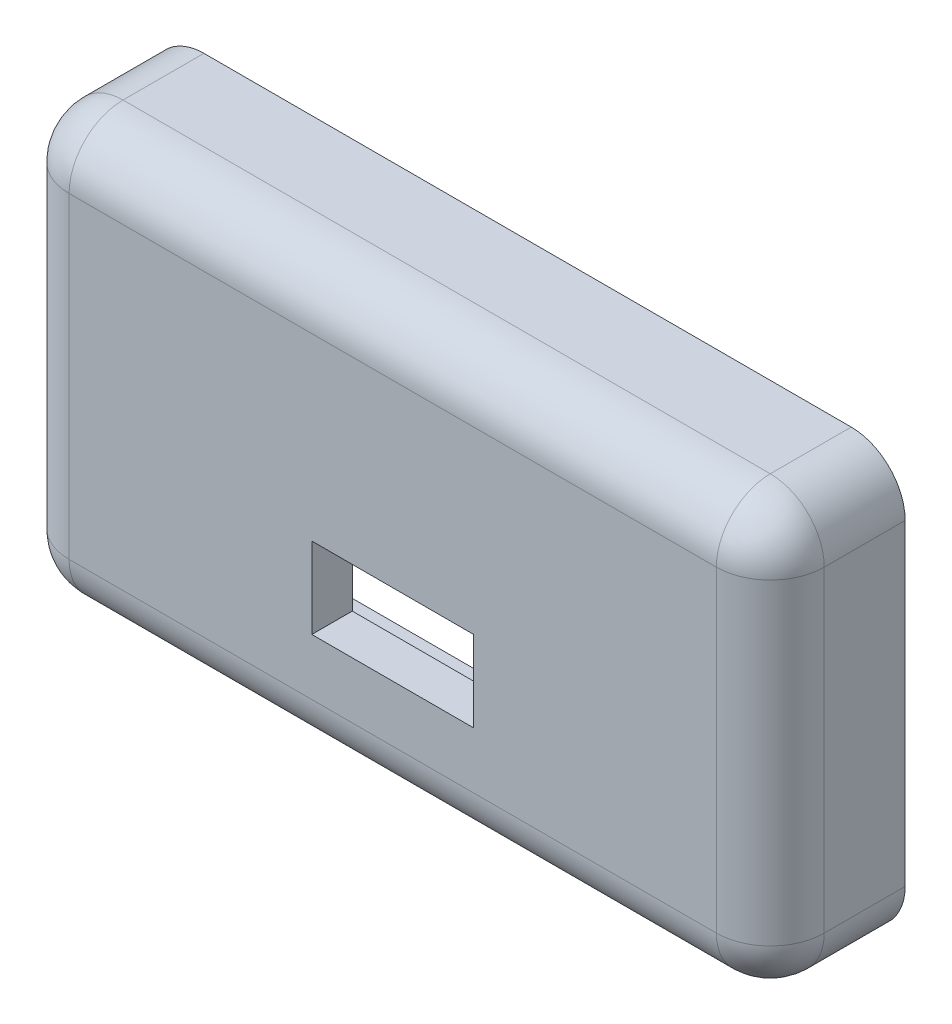
ISO-10303-21;
HEADER;
FILE_DESCRIPTION(('STEP AP214'),'2;1');
FILE_NAME('part.step','',(''),(''),'','','');
FILE_SCHEMA(('AUTOMOTIVE_DESIGN { 1 0 10303 214 1 1 1 1 }'));
ENDSEC;
DATA;
#1=APPLICATION_CONTEXT('core data for automotive mechanical design processes');
#2=APPLICATION_PROTOCOL_DEFINITION('international standard','automotive_design',2000,#1);
#3=PRODUCT_CONTEXT('',#1,'mechanical');
#4=PRODUCT('Part','Part','',(#3));
#5=PRODUCT_RELATED_PRODUCT_CATEGORY('part','',(#4));
#6=PRODUCT_DEFINITION_FORMATION('','',#4);
#7=PRODUCT_DEFINITION_CONTEXT('part definition',#1,'design');
#8=PRODUCT_DEFINITION('design','',#6,#7);
#9=PRODUCT_DEFINITION_SHAPE('','',#8);
#10=(LENGTH_UNIT() NAMED_UNIT(*) SI_UNIT(.MILLI.,.METRE.));
#11=(NAMED_UNIT(*) PLANE_ANGLE_UNIT() SI_UNIT($,.RADIAN.));
#12=(NAMED_UNIT(*) SI_UNIT($,.STERADIAN.) SOLID_ANGLE_UNIT());
#13=UNCERTAINTY_MEASURE_WITH_UNIT(LENGTH_MEASURE(1.E-05),#10,'distance_accuracy_value','');
#14=(GEOMETRIC_REPRESENTATION_CONTEXT(3) GLOBAL_UNCERTAINTY_ASSIGNED_CONTEXT((#13)) GLOBAL_UNIT_ASSIGNED_CONTEXT((#10,
#11,#12)) REPRESENTATION_CONTEXT('',''));
#15=CARTESIAN_POINT('',(0.,0.,0.));
#16=DIRECTION('',(0.,0.,1.));
#17=DIRECTION('',(1.,0.,0.));
#18=AXIS2_PLACEMENT_3D('',#15,#16,#17);
#19=CARTESIAN_POINT('',(0.,0.,0.));
#20=DIRECTION('',(0.,0.,1.));
#21=DIRECTION('',(1.,0.,0.));
#22=AXIS2_PLACEMENT_3D('',#19,#20,#21);
#23=PLANE('',#22);
#24=DIRECTION('',(-1.,0.,0.));
#25=VECTOR('',#24,1.);
#26=CARTESIAN_POINT('',(13.,-6.875,0.));
#27=LINE('',#26,#25);
#28=CARTESIAN_POINT('',(13.,-6.875,0.));
#29=VERTEX_POINT('',#28);
#30=CARTESIAN_POINT('',(-13.,-6.875,0.));
#31=VERTEX_POINT('',#30);
#32=EDGE_CURVE('E173',#29,#31,#27,.T.);
#33=ORIENTED_EDGE('',*,*,#32,.T.);
#34=DIRECTION('',(0.,1.,0.));
#35=VECTOR('',#34,1.);
#36=CARTESIAN_POINT('',(-13.,-6.875,0.));
#37=LINE('',#36,#35);
#38=CARTESIAN_POINT('',(-13.,6.875,0.));
#39=VERTEX_POINT('',#38);
#40=EDGE_CURVE('E192',#31,#39,#37,.T.);
#41=ORIENTED_EDGE('',*,*,#40,.T.);
#42=DIRECTION('',(1.,0.,0.));
#43=VECTOR('',#42,1.);
#44=CARTESIAN_POINT('',(13.,6.875,0.));
#45=LINE('',#44,#43);
#46=CARTESIAN_POINT('',(13.,6.875,0.));
#47=VERTEX_POINT('',#46);
#48=EDGE_CURVE('E179',#39,#47,#45,.T.);
#49=ORIENTED_EDGE('',*,*,#48,.T.);
#50=DIRECTION('',(0.,-1.,0.));
#51=VECTOR('',#50,1.);
#52=CARTESIAN_POINT('',(13.,-6.875,0.));
#53=LINE('',#52,#51);
#54=EDGE_CURVE('E195',#47,#29,#53,.T.);
#55=ORIENTED_EDGE('',*,*,#54,.T.);
#56=EDGE_LOOP('',(#33,#41,#49,#55));
#57=FACE_BOUND('',#56,.T.);
#58=CARTESIAN_POINT('',(-10.,0.,0.));
#59=DIRECTION('',(0.,0.,1.));
#60=DIRECTION('',(1.,0.,0.));
#61=AXIS2_PLACEMENT_3D('',#58,#59,#60);
#62=CIRCLE('',#61,2.475);
#63=CARTESIAN_POINT('',(-7.525,0.,0.));
#64=VERTEX_POINT('',#63);
#65=EDGE_CURVE('E267',#64,#64,#62,.F.);
#66=ORIENTED_EDGE('',*,*,#65,.F.);
#67=EDGE_LOOP('',(#66));
#68=FACE_BOUND('',#67,.T.);
#69=DIRECTION('',(0.,1.,0.));
#70=VECTOR('',#69,1.);
#71=CARTESIAN_POINT('',(3.,-0.785,0.));
#72=LINE('',#71,#70);
#73=CARTESIAN_POINT('',(3.,-3.785,0.));
#74=VERTEX_POINT('',#73);
#75=CARTESIAN_POINT('',(3.,-0.785,0.));
#76=VERTEX_POINT('',#75);
#77=EDGE_CURVE('E243',#74,#76,#72,.T.);
#78=ORIENTED_EDGE('',*,*,#77,.T.);
#79=DIRECTION('',(-1.,0.,0.));
#80=VECTOR('',#79,1.);
#81=CARTESIAN_POINT('',(-3.,-0.785,0.));
#82=LINE('',#81,#80);
#83=CARTESIAN_POINT('',(-3.,-0.785,0.));
#84=VERTEX_POINT('',#83);
#85=EDGE_CURVE('E248',#76,#84,#82,.T.);
#86=ORIENTED_EDGE('',*,*,#85,.T.);
#87=DIRECTION('',(0.,-1.,0.));
#88=VECTOR('',#87,1.);
#89=CARTESIAN_POINT('',(-3.,-0.785,0.));
#90=LINE('',#89,#88);
#91=CARTESIAN_POINT('',(-3.,-3.785,0.));
#92=VERTEX_POINT('',#91);
#93=EDGE_CURVE('E251',#84,#92,#90,.T.);
#94=ORIENTED_EDGE('',*,*,#93,.T.);
#95=DIRECTION('',(1.,0.,0.));
#96=VECTOR('',#95,1.);
#97=CARTESIAN_POINT('',(-3.,-3.785,0.));
#98=LINE('',#97,#96);
#99=EDGE_CURVE('E254',#92,#74,#98,.T.);
#100=ORIENTED_EDGE('',*,*,#99,.T.);
#101=EDGE_LOOP('',(#78,#86,#94,#100));
#102=FACE_BOUND('',#101,.T.);
#103=CARTESIAN_POINT('',(10.,0.,0.));
#104=DIRECTION('',(0.,0.,1.));
#105=DIRECTION('',(1.,0.,0.));
#106=AXIS2_PLACEMENT_3D('',#103,#104,#105);
#107=CIRCLE('',#106,2.475);
#108=CARTESIAN_POINT('',(12.475,0.,0.));
#109=VERTEX_POINT('',#108);
#110=EDGE_CURVE('E270',#109,#109,#107,.F.);
#111=ORIENTED_EDGE('',*,*,#110,.F.);
#112=EDGE_LOOP('',(#111));
#113=FACE_BOUND('',#112,.T.);
#114=ADVANCED_FACE('F38',(#57,#68,#102,#113),#23,.F.);
#115=CARTESIAN_POINT('',(14.,7.875,1.));
#116=DIRECTION('',(-1.,0.,0.));
#117=DIRECTION('',(0.,0.,1.));
#118=AXIS2_PLACEMENT_3D('',#115,#116,#117);
#119=PLANE('',#118);
#120=DIRECTION('',(0.,1.,0.));
#121=VECTOR('',#120,1.);
#122=CARTESIAN_POINT('',(14.,-7.875,-0.5));
#123=LINE('',#122,#121);
#124=CARTESIAN_POINT('',(14.,5.875,-0.5));
#125=VERTEX_POINT('',#124);
#126=CARTESIAN_POINT('',(14.,-5.875,-0.5));
#127=VERTEX_POINT('',#126);
#128=EDGE_CURVE('E275',#125,#127,#123,.F.);
#129=ORIENTED_EDGE('',*,*,#128,.T.);
#130=DIRECTION('',(0.,0.,-1.));
#131=VECTOR('',#130,1.);
#132=CARTESIAN_POINT('',(14.,-5.875,1.));
#133=LINE('',#132,#131);
#134=CARTESIAN_POINT('',(14.,-5.875,-3.5));
#135=VERTEX_POINT('',#134);
#136=EDGE_CURVE('E277',#127,#135,#133,.T.);
#137=ORIENTED_EDGE('',*,*,#136,.T.);
#138=DIRECTION('',(0.,-1.,0.));
#139=VECTOR('',#138,1.);
#140=CARTESIAN_POINT('',(14.,7.875,-3.5));
#141=LINE('',#140,#139);
#142=CARTESIAN_POINT('',(14.,5.875,-3.5));
#143=VERTEX_POINT('',#142);
#144=EDGE_CURVE('E206',#143,#135,#141,.T.);
#145=ORIENTED_EDGE('',*,*,#144,.F.);
#146=DIRECTION('',(0.,0.,-1.));
#147=VECTOR('',#146,1.);
#148=CARTESIAN_POINT('',(14.,5.875,1.));
#149=LINE('',#148,#147);
#150=EDGE_CURVE('E273',#143,#125,#149,.F.);
#151=ORIENTED_EDGE('',*,*,#150,.T.);
#152=EDGE_LOOP('',(#129,#137,#145,#151));
#153=FACE_BOUND('',#152,.T.);
#154=ADVANCED_FACE('F388',(#153),#119,.F.);
#155=CARTESIAN_POINT('',(-14.,7.875,1.));
#156=DIRECTION('',(0.,-1.,0.));
#157=DIRECTION('',(0.,0.,-1.));
#158=AXIS2_PLACEMENT_3D('',#155,#156,#157);
#159=PLANE('',#158);
#160=DIRECTION('',(-1.,0.,0.));
#161=VECTOR('',#160,1.);
#162=CARTESIAN_POINT('',(14.,7.875,-0.5));
#163=LINE('',#162,#161);
#164=CARTESIAN_POINT('',(-12.,7.875,-0.5));
#165=VERTEX_POINT('',#164);
#166=CARTESIAN_POINT('',(12.,7.875,-0.5));
#167=VERTEX_POINT('',#166);
#168=EDGE_CURVE('E305',#165,#167,#163,.F.);
#169=ORIENTED_EDGE('',*,*,#168,.T.);
#170=DIRECTION('',(0.,0.,-1.));
#171=VECTOR('',#170,1.);
#172=CARTESIAN_POINT('',(12.,7.875,1.));
#173=LINE('',#172,#171);
#174=CARTESIAN_POINT('',(12.,7.875,-3.5));
#175=VERTEX_POINT('',#174);
#176=EDGE_CURVE('E307',#167,#175,#173,.T.);
#177=ORIENTED_EDGE('',*,*,#176,.T.);
#178=DIRECTION('',(1.,0.,0.));
#179=VECTOR('',#178,1.);
#180=CARTESIAN_POINT('',(-14.,7.875,-3.5));
#181=LINE('',#180,#179);
#182=CARTESIAN_POINT('',(-12.,7.875,-3.5));
#183=VERTEX_POINT('',#182);
#184=EDGE_CURVE('E180',#183,#175,#181,.T.);
#185=ORIENTED_EDGE('',*,*,#184,.F.);
#186=DIRECTION('',(0.,0.,-1.));
#187=VECTOR('',#186,1.);
#188=CARTESIAN_POINT('',(-12.,7.875,1.));
#189=LINE('',#188,#187);
#190=EDGE_CURVE('E303',#183,#165,#189,.F.);
#191=ORIENTED_EDGE('',*,*,#190,.T.);
#192=EDGE_LOOP('',(#169,#177,#185,#191));
#193=FACE_BOUND('',#192,.T.);
#194=ADVANCED_FACE('F379',(#193),#159,.F.);
#195=CARTESIAN_POINT('',(-14.,7.875,1.));
#196=DIRECTION('',(1.,0.,0.));
#197=DIRECTION('',(0.,1.,0.));
#198=AXIS2_PLACEMENT_3D('',#195,#196,#197);
#199=PLANE('',#198);
#200=DIRECTION('',(0.,1.,0.));
#201=VECTOR('',#200,1.);
#202=CARTESIAN_POINT('',(-14.,-7.875,-3.5));
#203=LINE('',#202,#201);
#204=CARTESIAN_POINT('',(-14.,-5.875,-3.5));
#205=VERTEX_POINT('',#204);
#206=CARTESIAN_POINT('',(-14.,5.875,-3.5));
#207=VERTEX_POINT('',#206);
#208=EDGE_CURVE('E212',#205,#207,#203,.T.);
#209=ORIENTED_EDGE('',*,*,#208,.F.);
#210=DIRECTION('',(0.,0.,-1.));
#211=VECTOR('',#210,1.);
#212=CARTESIAN_POINT('',(-14.,-5.875,1.));
#213=LINE('',#212,#211);
#214=CARTESIAN_POINT('',(-14.,-5.875,-0.5));
#215=VERTEX_POINT('',#214);
#216=EDGE_CURVE('E11',#205,#215,#213,.F.);
#217=ORIENTED_EDGE('',*,*,#216,.T.);
#218=DIRECTION('',(0.,-1.,0.));
#219=VECTOR('',#218,1.);
#220=CARTESIAN_POINT('',(-14.,7.875,-0.5));
#221=LINE('',#220,#219);
#222=CARTESIAN_POINT('',(-14.,5.875,-0.5));
#223=VERTEX_POINT('',#222);
#224=EDGE_CURVE('E47',#215,#223,#221,.F.);
#225=ORIENTED_EDGE('',*,*,#224,.T.);
#226=DIRECTION('',(0.,0.,-1.));
#227=VECTOR('',#226,1.);
#228=CARTESIAN_POINT('',(-14.,5.875,1.));
#229=LINE('',#228,#227);
#230=EDGE_CURVE('E309',#223,#207,#229,.T.);
#231=ORIENTED_EDGE('',*,*,#230,.T.);
#232=EDGE_LOOP('',(#209,#217,#225,#231));
#233=FACE_BOUND('',#232,.T.);
#234=ADVANCED_FACE('F354',(#233),#199,.F.);
#235=CARTESIAN_POINT('',(-14.,-7.875,1.));
#236=DIRECTION('',(0.,1.,0.));
#237=DIRECTION('',(0.,0.,1.));
#238=AXIS2_PLACEMENT_3D('',#235,#236,#237);
#239=PLANE('',#238);
#240=DIRECTION('',(-1.,0.,0.));
#241=VECTOR('',#240,1.);
#242=CARTESIAN_POINT('',(14.,-7.875,-3.5));
#243=LINE('',#242,#241);
#244=CARTESIAN_POINT('',(12.,-7.875,-3.5));
#245=VERTEX_POINT('',#244);
#246=CARTESIAN_POINT('',(-12.,-7.875,-3.5));
#247=VERTEX_POINT('',#246);
#248=EDGE_CURVE('E209',#245,#247,#243,.T.);
#249=ORIENTED_EDGE('',*,*,#248,.F.);
#250=DIRECTION('',(0.,0.,-1.));
#251=VECTOR('',#250,1.);
#252=CARTESIAN_POINT('',(12.,-7.875,1.));
#253=LINE('',#252,#251);
#254=CARTESIAN_POINT('',(12.,-7.875,-0.5));
#255=VERTEX_POINT('',#254);
#256=EDGE_CURVE('E292',#245,#255,#253,.F.);
#257=ORIENTED_EDGE('',*,*,#256,.T.);
#258=DIRECTION('',(1.,0.,0.));
#259=VECTOR('',#258,1.);
#260=CARTESIAN_POINT('',(-14.,-7.875,-0.5));
#261=LINE('',#260,#259);
#262=CARTESIAN_POINT('',(-12.,-7.875,-0.5));
#263=VERTEX_POINT('',#262);
#264=EDGE_CURVE('E290',#255,#263,#261,.F.);
#265=ORIENTED_EDGE('',*,*,#264,.T.);
#266=DIRECTION('',(0.,0.,-1.));
#267=VECTOR('',#266,1.);
#268=CARTESIAN_POINT('',(-12.,-7.875,1.));
#269=LINE('',#268,#267);
#270=EDGE_CURVE('E288',#263,#247,#269,.T.);
#271=ORIENTED_EDGE('',*,*,#270,.T.);
#272=EDGE_LOOP('',(#249,#257,#265,#271));
#273=FACE_BOUND('',#272,.T.);
#274=ADVANCED_FACE('F397',(#273),#239,.F.);
#275=CARTESIAN_POINT('',(3.,-0.785,1.));
#276=DIRECTION('',(-1.,0.,0.));
#277=DIRECTION('',(0.,-1.,0.));
#278=AXIS2_PLACEMENT_3D('',#275,#276,#277);
#279=PLANE('',#278);
#280=ORIENTED_EDGE('',*,*,#77,.F.);
#281=DIRECTION('',(0.,0.,-1.));
#282=VECTOR('',#281,1.);
#283=CARTESIAN_POINT('',(3.,-3.785,1.));
#284=LINE('',#283,#282);
#285=CARTESIAN_POINT('',(3.,-3.785,1.5));
#286=VERTEX_POINT('',#285);
#287=EDGE_CURVE('E257',#286,#74,#284,.T.);
#288=ORIENTED_EDGE('',*,*,#287,.F.);
#289=DIRECTION('',(0.,1.,0.));
#290=VECTOR('',#289,1.);
#291=CARTESIAN_POINT('',(3.,-3.785,1.5));
#292=LINE('',#291,#290);
#293=CARTESIAN_POINT('',(3.,-0.785,1.5));
#294=VERTEX_POINT('',#293);
#295=EDGE_CURVE('E230',#286,#294,#292,.T.);
#296=ORIENTED_EDGE('',*,*,#295,.T.);
#297=DIRECTION('',(0.,0.,-1.));
#298=VECTOR('',#297,1.);
#299=CARTESIAN_POINT('',(3.,-0.785,1.));
#300=LINE('',#299,#298);
#301=EDGE_CURVE('E264',#294,#76,#300,.T.);
#302=ORIENTED_EDGE('',*,*,#301,.T.);
#303=EDGE_LOOP('',(#280,#288,#296,#302));
#304=FACE_BOUND('',#303,.T.);
#305=ADVANCED_FACE('F426',(#304),#279,.T.);
#306=CARTESIAN_POINT('',(-3.,-0.785,1.));
#307=DIRECTION('',(0.,-1.,0.));
#308=DIRECTION('',(0.,0.,-1.));
#309=AXIS2_PLACEMENT_3D('',#306,#307,#308);
#310=PLANE('',#309);
#311=ORIENTED_EDGE('',*,*,#85,.F.);
#312=ORIENTED_EDGE('',*,*,#301,.F.);
#313=DIRECTION('',(-1.,0.,0.));
#314=VECTOR('',#313,1.);
#315=CARTESIAN_POINT('',(3.,-0.785,1.5));
#316=LINE('',#315,#314);
#317=CARTESIAN_POINT('',(-3.,-0.785,1.5));
#318=VERTEX_POINT('',#317);
#319=EDGE_CURVE('E233',#294,#318,#316,.T.);
#320=ORIENTED_EDGE('',*,*,#319,.T.);
#321=DIRECTION('',(0.,0.,-1.));
#322=VECTOR('',#321,1.);
#323=CARTESIAN_POINT('',(-3.,-0.785,1.));
#324=LINE('',#323,#322);
#325=EDGE_CURVE('E262',#318,#84,#324,.T.);
#326=ORIENTED_EDGE('',*,*,#325,.T.);
#327=EDGE_LOOP('',(#311,#312,#320,#326));
#328=FACE_BOUND('',#327,.T.);
#329=ADVANCED_FACE('F696',(#328),#310,.T.);
#330=CARTESIAN_POINT('',(-3.,-0.785,1.));
#331=DIRECTION('',(1.,0.,0.));
#332=DIRECTION('',(0.,1.,0.));
#333=AXIS2_PLACEMENT_3D('',#330,#331,#332);
#334=PLANE('',#333);
#335=ORIENTED_EDGE('',*,*,#93,.F.);
#336=ORIENTED_EDGE('',*,*,#325,.F.);
#337=DIRECTION('',(0.,-1.,0.));
#338=VECTOR('',#337,1.);
#339=CARTESIAN_POINT('',(-3.,-0.785,1.5));
#340=LINE('',#339,#338);
#341=CARTESIAN_POINT('',(-3.,-3.785,1.5));
#342=VERTEX_POINT('',#341);
#343=EDGE_CURVE('E236',#318,#342,#340,.T.);
#344=ORIENTED_EDGE('',*,*,#343,.T.);
#345=DIRECTION('',(0.,0.,-1.));
#346=VECTOR('',#345,1.);
#347=CARTESIAN_POINT('',(-3.,-3.785,1.));
#348=LINE('',#347,#346);
#349=EDGE_CURVE('E260',#342,#92,#348,.T.);
#350=ORIENTED_EDGE('',*,*,#349,.T.);
#351=EDGE_LOOP('',(#335,#336,#344,#350));
#352=FACE_BOUND('',#351,.T.);
#353=ADVANCED_FACE('F684',(#352),#334,.T.);
#354=CARTESIAN_POINT('',(-3.,-3.785,1.));
#355=DIRECTION('',(0.,1.,0.));
#356=DIRECTION('',(0.,0.,1.));
#357=AXIS2_PLACEMENT_3D('',#354,#355,#356);
#358=PLANE('',#357);
#359=ORIENTED_EDGE('',*,*,#99,.F.);
#360=ORIENTED_EDGE('',*,*,#349,.F.);
#361=DIRECTION('',(1.,0.,0.));
#362=VECTOR('',#361,1.);
#363=CARTESIAN_POINT('',(-3.,-3.785,1.5));
#364=LINE('',#363,#362);
#365=EDGE_CURVE('E227',#342,#286,#364,.T.);
#366=ORIENTED_EDGE('',*,*,#365,.T.);
#367=ORIENTED_EDGE('',*,*,#287,.T.);
#368=EDGE_LOOP('',(#359,#360,#366,#367));
#369=FACE_BOUND('',#368,.T.);
#370=ADVANCED_FACE('F662',(#369),#358,.T.);
#371=CARTESIAN_POINT('',(0.,0.,1.5));
#372=DIRECTION('',(0.,0.,1.));
#373=DIRECTION('',(1.,0.,0.));
#374=AXIS2_PLACEMENT_3D('',#371,#372,#373);
#375=PLANE('',#374);
#376=DIRECTION('',(0.,-1.,0.));
#377=VECTOR('',#376,1.);
#378=CARTESIAN_POINT('',(-12.,-7.875,1.5));
#379=LINE('',#378,#377);
#380=CARTESIAN_POINT('',(-12.,5.875,1.5));
#381=VERTEX_POINT('',#380);
#382=CARTESIAN_POINT('',(-12.,-5.875,1.5));
#383=VERTEX_POINT('',#382);
#384=EDGE_CURVE('E294',#381,#383,#379,.T.);
#385=ORIENTED_EDGE('',*,*,#384,.T.);
#386=DIRECTION('',(1.,0.,0.));
#387=VECTOR('',#386,1.);
#388=CARTESIAN_POINT('',(14.,-5.875,1.5));
#389=LINE('',#388,#387);
#390=CARTESIAN_POINT('',(12.,-5.875,1.5));
#391=VERTEX_POINT('',#390);
#392=EDGE_CURVE('E300',#383,#391,#389,.T.);
#393=ORIENTED_EDGE('',*,*,#392,.T.);
#394=DIRECTION('',(0.,1.,0.));
#395=VECTOR('',#394,1.);
#396=CARTESIAN_POINT('',(12.,7.875,1.5));
#397=LINE('',#396,#395);
#398=CARTESIAN_POINT('',(12.,5.875,1.5));
#399=VERTEX_POINT('',#398);
#400=EDGE_CURVE('E298',#391,#399,#397,.T.);
#401=ORIENTED_EDGE('',*,*,#400,.T.);
#402=DIRECTION('',(-1.,0.,0.));
#403=VECTOR('',#402,1.);
#404=CARTESIAN_POINT('',(-14.,5.875,1.5));
#405=LINE('',#404,#403);
#406=EDGE_CURVE('E296',#399,#381,#405,.T.);
#407=ORIENTED_EDGE('',*,*,#406,.T.);
#408=EDGE_LOOP('',(#385,#393,#401,#407));
#409=FACE_BOUND('',#408,.T.);
#410=ORIENTED_EDGE('',*,*,#295,.F.);
#411=ORIENTED_EDGE('',*,*,#365,.F.);
#412=ORIENTED_EDGE('',*,*,#343,.F.);
#413=ORIENTED_EDGE('',*,*,#319,.F.);
#414=EDGE_LOOP('',(#410,#411,#412,#413));
#415=FACE_BOUND('',#414,.T.);
#416=ADVANCED_FACE('F370',(#409,#415),#375,.T.);
#417=CARTESIAN_POINT('',(-10.,0.,-1.));
#418=DIRECTION('',(0.,0.,-1.));
#419=DIRECTION('',(-1.,0.,0.));
#420=AXIS2_PLACEMENT_3D('',#417,#418,#419);
#421=PLANE('',#420);
#422=CARTESIAN_POINT('',(-10.,0.,-1.));
#423=DIRECTION('',(0.,0.,-1.));
#424=DIRECTION('',(-1.,0.,0.));
#425=AXIS2_PLACEMENT_3D('',#422,#423,#424);
#426=CIRCLE('',#425,2.475);
#427=CARTESIAN_POINT('',(-12.475,0.,-1.));
#428=VERTEX_POINT('',#427);
#429=EDGE_CURVE('E224',#428,#428,#426,.T.);
#430=ORIENTED_EDGE('',*,*,#429,.T.);
#431=EDGE_LOOP('',(#430));
#432=FACE_BOUND('',#431,.T.);
#433=CARTESIAN_POINT('',(-10.,0.,-1.));
#434=DIRECTION('',(0.,0.,-1.));
#435=DIRECTION('',(-1.,0.,0.));
#436=AXIS2_PLACEMENT_3D('',#433,#434,#435);
#437=CIRCLE('',#436,1.475);
#438=CARTESIAN_POINT('',(-11.475,0.,-1.));
#439=VERTEX_POINT('',#438);
#440=EDGE_CURVE('E221',#439,#439,#437,.T.);
#441=ORIENTED_EDGE('',*,*,#440,.F.);
#442=EDGE_LOOP('',(#441));
#443=FACE_BOUND('',#442,.T.);
#444=ADVANCED_FACE('F641',(#432,#443),#421,.T.);
#445=CARTESIAN_POINT('',(-10.,0.,-1.));
#446=DIRECTION('',(0.,0.,1.));
#447=DIRECTION('',(1.,0.,0.));
#448=AXIS2_PLACEMENT_3D('',#445,#446,#447);
#449=CYLINDRICAL_SURFACE('',#448,2.475);
#450=ORIENTED_EDGE('',*,*,#429,.F.);
#451=EDGE_LOOP('',(#450));
#452=FACE_BOUND('',#451,.T.);
#453=ORIENTED_EDGE('',*,*,#65,.T.);
#454=EDGE_LOOP('',(#453));
#455=FACE_BOUND('',#454,.T.);
#456=ADVANCED_FACE('F636',(#452,#455),#449,.T.);
#457=CARTESIAN_POINT('',(0.,0.,1.));
#458=DIRECTION('',(0.,0.,1.));
#459=DIRECTION('',(1.,0.,0.));
#460=AXIS2_PLACEMENT_3D('',#457,#458,#459);
#461=PLANE('',#460);
#462=CARTESIAN_POINT('',(-10.,0.,1.));
#463=DIRECTION('',(0.,0.,1.));
#464=DIRECTION('',(1.,0.,0.));
#465=AXIS2_PLACEMENT_3D('',#462,#463,#464);
#466=CIRCLE('',#465,1.475);
#467=CARTESIAN_POINT('',(-8.525,0.,1.));
#468=VERTEX_POINT('',#467);
#469=EDGE_CURVE('E239',#468,#468,#466,.T.);
#470=ORIENTED_EDGE('',*,*,#469,.F.);
#471=EDGE_LOOP('',(#470));
#472=FACE_BOUND('',#471,.T.);
#473=ADVANCED_FACE('F628',(#472),#461,.F.);
#474=CARTESIAN_POINT('',(-10.,0.,-0.000999999999999916));
#475=DIRECTION('',(0.,0.,1.));
#476=DIRECTION('',(1.,0.,0.));
#477=AXIS2_PLACEMENT_3D('',#474,#475,#476);
#478=CYLINDRICAL_SURFACE('',#477,1.475);
#479=ORIENTED_EDGE('',*,*,#469,.T.);
#480=EDGE_LOOP('',(#479));
#481=FACE_BOUND('',#480,.T.);
#482=ORIENTED_EDGE('',*,*,#440,.T.);
#483=EDGE_LOOP('',(#482));
#484=FACE_BOUND('',#483,.T.);
#485=ADVANCED_FACE('F619',(#481,#484),#478,.F.);
#486=CARTESIAN_POINT('',(10.,0.,-1.));
#487=DIRECTION('',(0.,0.,-1.));
#488=DIRECTION('',(-1.,0.,0.));
#489=AXIS2_PLACEMENT_3D('',#486,#487,#488);
#490=PLANE('',#489);
#491=CARTESIAN_POINT('',(10.,0.,-1.));
#492=DIRECTION('',(0.,0.,-1.));
#493=DIRECTION('',(-1.,0.,0.));
#494=AXIS2_PLACEMENT_3D('',#491,#492,#493);
#495=CIRCLE('',#494,2.475);
#496=CARTESIAN_POINT('',(7.525,0.,-1.));
#497=VERTEX_POINT('',#496);
#498=EDGE_CURVE('E218',#497,#497,#495,.T.);
#499=ORIENTED_EDGE('',*,*,#498,.T.);
#500=EDGE_LOOP('',(#499));
#501=FACE_BOUND('',#500,.T.);
#502=CARTESIAN_POINT('',(10.,0.,-1.));
#503=DIRECTION('',(0.,0.,-1.));
#504=DIRECTION('',(-1.,0.,0.));
#505=AXIS2_PLACEMENT_3D('',#502,#503,#504);
#506=CIRCLE('',#505,1.475);
#507=CARTESIAN_POINT('',(8.525,0.,-1.));
#508=VERTEX_POINT('',#507);
#509=EDGE_CURVE('E215',#508,#508,#506,.T.);
#510=ORIENTED_EDGE('',*,*,#509,.F.);
#511=EDGE_LOOP('',(#510));
#512=FACE_BOUND('',#511,.T.);
#513=ADVANCED_FACE('F610',(#501,#512),#490,.T.);
#514=CARTESIAN_POINT('',(10.,0.,-1.));
#515=DIRECTION('',(0.,0.,1.));
#516=DIRECTION('',(1.,0.,0.));
#517=AXIS2_PLACEMENT_3D('',#514,#515,#516);
#518=CYLINDRICAL_SURFACE('',#517,2.475);
#519=ORIENTED_EDGE('',*,*,#498,.F.);
#520=EDGE_LOOP('',(#519));
#521=FACE_BOUND('',#520,.T.);
#522=ORIENTED_EDGE('',*,*,#110,.T.);
#523=EDGE_LOOP('',(#522));
#524=FACE_BOUND('',#523,.T.);
#525=ADVANCED_FACE('F605',(#521,#524),#518,.T.);
#526=CARTESIAN_POINT('',(10.,0.,1.));
#527=DIRECTION('',(0.,0.,1.));
#528=DIRECTION('',(1.,0.,0.));
#529=AXIS2_PLACEMENT_3D('',#526,#527,#528);
#530=CIRCLE('',#529,1.475);
#531=CARTESIAN_POINT('',(11.475,0.,1.));
#532=VERTEX_POINT('',#531);
#533=EDGE_CURVE('E240',#532,#532,#530,.T.);
#534=ORIENTED_EDGE('',*,*,#533,.F.);
#535=EDGE_LOOP('',(#534));
#536=FACE_BOUND('',#535,.T.);
#537=ADVANCED_FACE('F597',(#536),#461,.F.);
#538=CARTESIAN_POINT('',(10.,0.,-0.000999999999999916));
#539=DIRECTION('',(0.,0.,1.));
#540=DIRECTION('',(1.,0.,0.));
#541=AXIS2_PLACEMENT_3D('',#538,#539,#540);
#542=CYLINDRICAL_SURFACE('',#541,1.475);
#543=ORIENTED_EDGE('',*,*,#533,.T.);
#544=EDGE_LOOP('',(#543));
#545=FACE_BOUND('',#544,.T.);
#546=ORIENTED_EDGE('',*,*,#509,.T.);
#547=EDGE_LOOP('',(#546));
#548=FACE_BOUND('',#547,.T.);
#549=ADVANCED_FACE('F551',(#545,#548),#542,.F.);
#550=CARTESIAN_POINT('',(0.,0.,-3.5));
#551=DIRECTION('',(0.,0.,-1.));
#552=DIRECTION('',(-1.,0.,0.));
#553=AXIS2_PLACEMENT_3D('',#550,#551,#552);
#554=PLANE('',#553);
#555=ORIENTED_EDGE('',*,*,#144,.T.);
#556=CARTESIAN_POINT('',(12.,-5.875,-3.5));
#557=DIRECTION('',(0.,0.,-1.));
#558=DIRECTION('',(-1.,0.,0.));
#559=AXIS2_PLACEMENT_3D('',#556,#557,#558);
#560=CIRCLE('',#559,2.);
#561=EDGE_CURVE('E286',#135,#245,#560,.T.);
#562=ORIENTED_EDGE('',*,*,#561,.T.);
#563=ORIENTED_EDGE('',*,*,#248,.T.);
#564=CARTESIAN_POINT('',(-12.,-5.875,-3.5));
#565=DIRECTION('',(0.,0.,-1.));
#566=DIRECTION('',(-1.,0.,0.));
#567=AXIS2_PLACEMENT_3D('',#564,#565,#566);
#568=CIRCLE('',#567,2.);
#569=EDGE_CURVE('E282',#247,#205,#568,.T.);
#570=ORIENTED_EDGE('',*,*,#569,.T.);
#571=ORIENTED_EDGE('',*,*,#208,.T.);
#572=CARTESIAN_POINT('',(-12.,5.875,-3.5));
#573=DIRECTION('',(0.,0.,-1.));
#574=DIRECTION('',(-1.,0.,0.));
#575=AXIS2_PLACEMENT_3D('',#572,#573,#574);
#576=CIRCLE('',#575,2.);
#577=EDGE_CURVE('E280',#207,#183,#576,.T.);
#578=ORIENTED_EDGE('',*,*,#577,.T.);
#579=ORIENTED_EDGE('',*,*,#184,.T.);
#580=CARTESIAN_POINT('',(12.,5.875,-3.5));
#581=DIRECTION('',(0.,0.,-1.));
#582=DIRECTION('',(-1.,0.,0.));
#583=AXIS2_PLACEMENT_3D('',#580,#581,#582);
#584=CIRCLE('',#583,2.);
#585=EDGE_CURVE('E284',#175,#143,#584,.T.);
#586=ORIENTED_EDGE('',*,*,#585,.T.);
#587=EDGE_LOOP('',(#555,#562,#563,#570,#571,#578,#579,#586));
#588=FACE_BOUND('',#587,.T.);
#589=DIRECTION('',(1.,0.,0.));
#590=VECTOR('',#589,1.);
#591=CARTESIAN_POINT('',(13.,6.875,-3.5));
#592=LINE('',#591,#590);
#593=CARTESIAN_POINT('',(-13.,6.875,-3.5));
#594=VERTEX_POINT('',#593);
#595=CARTESIAN_POINT('',(13.,6.875,-3.5));
#596=VERTEX_POINT('',#595);
#597=EDGE_CURVE('E172',#594,#596,#592,.T.);
#598=ORIENTED_EDGE('',*,*,#597,.F.);
#599=DIRECTION('',(0.,1.,0.));
#600=VECTOR('',#599,1.);
#601=CARTESIAN_POINT('',(-13.,-6.875,-3.5));
#602=LINE('',#601,#600);
#603=CARTESIAN_POINT('',(-13.,-6.875,-3.5));
#604=VERTEX_POINT('',#603);
#605=EDGE_CURVE('E162',#604,#594,#602,.T.);
#606=ORIENTED_EDGE('',*,*,#605,.F.);
#607=DIRECTION('',(-1.,0.,0.));
#608=VECTOR('',#607,1.);
#609=CARTESIAN_POINT('',(13.,-6.875,-3.5));
#610=LINE('',#609,#608);
#611=CARTESIAN_POINT('',(13.,-6.875,-3.5));
#612=VERTEX_POINT('',#611);
#613=EDGE_CURVE('E188',#612,#604,#610,.T.);
#614=ORIENTED_EDGE('',*,*,#613,.F.);
#615=DIRECTION('',(0.,-1.,0.));
#616=VECTOR('',#615,1.);
#617=CARTESIAN_POINT('',(13.,-6.875,-3.5));
#618=LINE('',#617,#616);
#619=EDGE_CURVE('E186',#596,#612,#618,.T.);
#620=ORIENTED_EDGE('',*,*,#619,.F.);
#621=EDGE_LOOP('',(#598,#606,#614,#620));
#622=FACE_BOUND('',#621,.T.);
#623=ADVANCED_FACE('F184',(#588,#622),#554,.T.);
#624=CARTESIAN_POINT('',(-13.,-6.875,-3.5));
#625=DIRECTION('',(1.,0.,0.));
#626=DIRECTION('',(0.,0.,-1.));
#627=AXIS2_PLACEMENT_3D('',#624,#625,#626);
#628=PLANE('',#627);
#629=ORIENTED_EDGE('',*,*,#40,.F.);
#630=DIRECTION('',(0.,0.,1.));
#631=VECTOR('',#630,1.);
#632=CARTESIAN_POINT('',(-13.,-6.875,-3.5));
#633=LINE('',#632,#631);
#634=EDGE_CURVE('E168',#604,#31,#633,.T.);
#635=ORIENTED_EDGE('',*,*,#634,.F.);
#636=ORIENTED_EDGE('',*,*,#605,.T.);
#637=DIRECTION('',(0.,0.,1.));
#638=VECTOR('',#637,1.);
#639=CARTESIAN_POINT('',(-13.,6.875,-3.5));
#640=LINE('',#639,#638);
#641=EDGE_CURVE('E166',#594,#39,#640,.T.);
#642=ORIENTED_EDGE('',*,*,#641,.T.);
#643=EDGE_LOOP('',(#629,#635,#636,#642));
#644=FACE_BOUND('',#643,.T.);
#645=ADVANCED_FACE('F165',(#644),#628,.T.);
#646=CARTESIAN_POINT('',(13.,6.875,-3.5));
#647=DIRECTION('',(0.,-1.,0.));
#648=DIRECTION('',(0.,0.,-1.));
#649=AXIS2_PLACEMENT_3D('',#646,#647,#648);
#650=PLANE('',#649);
#651=ORIENTED_EDGE('',*,*,#48,.F.);
#652=ORIENTED_EDGE('',*,*,#641,.F.);
#653=ORIENTED_EDGE('',*,*,#597,.T.);
#654=DIRECTION('',(0.,0.,1.));
#655=VECTOR('',#654,1.);
#656=CARTESIAN_POINT('',(13.,6.875,-3.5));
#657=LINE('',#656,#655);
#658=EDGE_CURVE('E181',#596,#47,#657,.T.);
#659=ORIENTED_EDGE('',*,*,#658,.T.);
#660=EDGE_LOOP('',(#651,#652,#653,#659));
#661=FACE_BOUND('',#660,.T.);
#662=ADVANCED_FACE('F176',(#661),#650,.T.);
#663=CARTESIAN_POINT('',(13.,-6.875,-3.5));
#664=DIRECTION('',(-1.,0.,0.));
#665=DIRECTION('',(0.,0.,1.));
#666=AXIS2_PLACEMENT_3D('',#663,#664,#665);
#667=PLANE('',#666);
#668=ORIENTED_EDGE('',*,*,#54,.F.);
#669=ORIENTED_EDGE('',*,*,#658,.F.);
#670=ORIENTED_EDGE('',*,*,#619,.T.);
#671=DIRECTION('',(0.,0.,1.));
#672=VECTOR('',#671,1.);
#673=CARTESIAN_POINT('',(13.,-6.875,-3.5));
#674=LINE('',#673,#672);
#675=EDGE_CURVE('E201',#612,#29,#674,.T.);
#676=ORIENTED_EDGE('',*,*,#675,.T.);
#677=EDGE_LOOP('',(#668,#669,#670,#676));
#678=FACE_BOUND('',#677,.T.);
#679=ADVANCED_FACE('F520',(#678),#667,.T.);
#680=CARTESIAN_POINT('',(13.,-6.875,-3.5));
#681=DIRECTION('',(0.,1.,0.));
#682=DIRECTION('',(0.,0.,1.));
#683=AXIS2_PLACEMENT_3D('',#680,#681,#682);
#684=PLANE('',#683);
#685=ORIENTED_EDGE('',*,*,#32,.F.);
#686=ORIENTED_EDGE('',*,*,#675,.F.);
#687=ORIENTED_EDGE('',*,*,#613,.T.);
#688=ORIENTED_EDGE('',*,*,#634,.T.);
#689=EDGE_LOOP('',(#685,#686,#687,#688));
#690=FACE_BOUND('',#689,.T.);
#691=ADVANCED_FACE('F512',(#690),#684,.T.);
#692=CARTESIAN_POINT('',(-12.,5.875,1.));
#693=DIRECTION('',(0.,0.,-1.));
#694=DIRECTION('',(-1.,0.,0.));
#695=AXIS2_PLACEMENT_3D('',#692,#693,#694);
#696=CYLINDRICAL_SURFACE('',#695,2.);
#697=CARTESIAN_POINT('',(-12.,5.875,-0.5));
#698=DIRECTION('',(0.,0.,1.));
#699=DIRECTION('',(1.,0.,0.));
#700=AXIS2_PLACEMENT_3D('',#697,#698,#699);
#701=CIRCLE('',#700,2.);
#702=EDGE_CURVE('E42',#165,#223,#701,.T.);
#703=ORIENTED_EDGE('',*,*,#702,.F.);
#704=ORIENTED_EDGE('',*,*,#190,.F.);
#705=ORIENTED_EDGE('',*,*,#577,.F.);
#706=ORIENTED_EDGE('',*,*,#230,.F.);
#707=EDGE_LOOP('',(#703,#704,#705,#706));
#708=FACE_BOUND('',#707,.T.);
#709=ADVANCED_FACE('F40',(#708),#696,.T.);
#710=CARTESIAN_POINT('',(-12.,5.875,-0.5));
#711=DIRECTION('',(0.,0.,1.));
#712=DIRECTION('',(1.,0.,0.));
#713=AXIS2_PLACEMENT_3D('',#710,#711,#712);
#714=SPHERICAL_SURFACE('',#713,2.);
#715=CARTESIAN_POINT('',(-12.,5.875,-0.5));
#716=DIRECTION('',(-1.,0.,0.));
#717=DIRECTION('',(0.,-1.,0.));
#718=AXIS2_PLACEMENT_3D('',#715,#716,#717);
#719=CIRCLE('',#718,2.);
#720=EDGE_CURVE('E338',#165,#381,#719,.F.);
#721=ORIENTED_EDGE('',*,*,#720,.F.);
#722=ORIENTED_EDGE('',*,*,#702,.T.);
#723=CARTESIAN_POINT('',(-12.,5.875,-0.5));
#724=DIRECTION('',(0.,1.,0.));
#725=DIRECTION('',(0.,0.,1.));
#726=AXIS2_PLACEMENT_3D('',#723,#724,#725);
#727=CIRCLE('',#726,2.);
#728=EDGE_CURVE('E340',#381,#223,#727,.F.);
#729=ORIENTED_EDGE('',*,*,#728,.F.);
#730=EDGE_LOOP('',(#721,#722,#729));
#731=FACE_BOUND('',#730,.T.);
#732=ADVANCED_FACE('F349',(#731),#714,.T.);
#733=CARTESIAN_POINT('',(-12.,-5.875,1.));
#734=DIRECTION('',(0.,0.,-1.));
#735=DIRECTION('',(-1.,0.,0.));
#736=AXIS2_PLACEMENT_3D('',#733,#734,#735);
#737=CYLINDRICAL_SURFACE('',#736,2.);
#738=ORIENTED_EDGE('',*,*,#569,.F.);
#739=ORIENTED_EDGE('',*,*,#270,.F.);
#740=CARTESIAN_POINT('',(-12.,-5.875,-0.5));
#741=DIRECTION('',(0.,0.,1.));
#742=DIRECTION('',(1.,0.,0.));
#743=AXIS2_PLACEMENT_3D('',#740,#741,#742);
#744=CIRCLE('',#743,2.);
#745=EDGE_CURVE('E335',#215,#263,#744,.T.);
#746=ORIENTED_EDGE('',*,*,#745,.F.);
#747=ORIENTED_EDGE('',*,*,#216,.F.);
#748=EDGE_LOOP('',(#738,#739,#746,#747));
#749=FACE_BOUND('',#748,.T.);
#750=ADVANCED_FACE('F361',(#749),#737,.T.);
#751=CARTESIAN_POINT('',(-12.,0.,-0.5));
#752=DIRECTION('',(0.,1.,0.));
#753=DIRECTION('',(-1.,0.,0.));
#754=AXIS2_PLACEMENT_3D('',#751,#752,#753);
#755=CYLINDRICAL_SURFACE('',#754,2.);
#756=ORIENTED_EDGE('',*,*,#728,.T.);
#757=ORIENTED_EDGE('',*,*,#224,.F.);
#758=CARTESIAN_POINT('',(-12.,-5.875,-0.5));
#759=DIRECTION('',(0.,-1.,0.));
#760=DIRECTION('',(0.,0.,-1.));
#761=AXIS2_PLACEMENT_3D('',#758,#759,#760);
#762=CIRCLE('',#761,2.);
#763=EDGE_CURVE('E332',#383,#215,#762,.T.);
#764=ORIENTED_EDGE('',*,*,#763,.F.);
#765=ORIENTED_EDGE('',*,*,#384,.F.);
#766=EDGE_LOOP('',(#756,#757,#764,#765));
#767=FACE_BOUND('',#766,.T.);
#768=ADVANCED_FACE('F368',(#767),#755,.T.);
#769=CARTESIAN_POINT('',(0.,5.875,-0.5));
#770=DIRECTION('',(1.,0.,0.));
#771=DIRECTION('',(0.,0.,-1.));
#772=AXIS2_PLACEMENT_3D('',#769,#770,#771);
#773=CYLINDRICAL_SURFACE('',#772,2.);
#774=ORIENTED_EDGE('',*,*,#720,.T.);
#775=ORIENTED_EDGE('',*,*,#406,.F.);
#776=CARTESIAN_POINT('',(12.,5.875,-0.5));
#777=DIRECTION('',(1.,0.,0.));
#778=DIRECTION('',(0.,0.,-1.));
#779=AXIS2_PLACEMENT_3D('',#776,#777,#778);
#780=CIRCLE('',#779,2.);
#781=EDGE_CURVE('E329',#167,#399,#780,.T.);
#782=ORIENTED_EDGE('',*,*,#781,.F.);
#783=ORIENTED_EDGE('',*,*,#168,.F.);
#784=EDGE_LOOP('',(#774,#775,#782,#783));
#785=FACE_BOUND('',#784,.T.);
#786=ADVANCED_FACE('F376',(#785),#773,.T.);
#787=CARTESIAN_POINT('',(12.,5.875,1.));
#788=DIRECTION('',(0.,0.,-1.));
#789=DIRECTION('',(-1.,0.,0.));
#790=AXIS2_PLACEMENT_3D('',#787,#788,#789);
#791=CYLINDRICAL_SURFACE('',#790,2.);
#792=ORIENTED_EDGE('',*,*,#585,.F.);
#793=ORIENTED_EDGE('',*,*,#176,.F.);
#794=CARTESIAN_POINT('',(12.,5.875,-0.5));
#795=DIRECTION('',(0.,0.,1.));
#796=DIRECTION('',(1.,0.,0.));
#797=AXIS2_PLACEMENT_3D('',#794,#795,#796);
#798=CIRCLE('',#797,2.);
#799=EDGE_CURVE('E326',#125,#167,#798,.T.);
#800=ORIENTED_EDGE('',*,*,#799,.F.);
#801=ORIENTED_EDGE('',*,*,#150,.F.);
#802=EDGE_LOOP('',(#792,#793,#800,#801));
#803=FACE_BOUND('',#802,.T.);
#804=ADVANCED_FACE('F383',(#803),#791,.T.);
#805=CARTESIAN_POINT('',(-12.,-5.875,-0.5));
#806=DIRECTION('',(0.,0.,1.));
#807=DIRECTION('',(1.,0.,0.));
#808=AXIS2_PLACEMENT_3D('',#805,#806,#807);
#809=SPHERICAL_SURFACE('',#808,2.);
#810=ORIENTED_EDGE('',*,*,#763,.T.);
#811=ORIENTED_EDGE('',*,*,#745,.T.);
#812=CARTESIAN_POINT('',(-12.,-5.875,-0.5));
#813=DIRECTION('',(-1.,0.,0.));
#814=DIRECTION('',(0.,0.,1.));
#815=AXIS2_PLACEMENT_3D('',#812,#813,#814);
#816=CIRCLE('',#815,2.);
#817=EDGE_CURVE('E323',#383,#263,#816,.F.);
#818=ORIENTED_EDGE('',*,*,#817,.F.);
#819=EDGE_LOOP('',(#810,#811,#818));
#820=FACE_BOUND('',#819,.T.);
#821=ADVANCED_FACE('F366',(#820),#809,.T.);
#822=CARTESIAN_POINT('',(12.,5.875,-0.5));
#823=DIRECTION('',(0.,0.,1.));
#824=DIRECTION('',(1.,0.,0.));
#825=AXIS2_PLACEMENT_3D('',#822,#823,#824);
#826=SPHERICAL_SURFACE('',#825,2.);
#827=ORIENTED_EDGE('',*,*,#799,.T.);
#828=ORIENTED_EDGE('',*,*,#781,.T.);
#829=CARTESIAN_POINT('',(12.,5.875,-0.5));
#830=DIRECTION('',(0.,1.,0.));
#831=DIRECTION('',(0.,0.,1.));
#832=AXIS2_PLACEMENT_3D('',#829,#830,#831);
#833=CIRCLE('',#832,2.);
#834=EDGE_CURVE('E320',#125,#399,#833,.F.);
#835=ORIENTED_EDGE('',*,*,#834,.F.);
#836=EDGE_LOOP('',(#827,#828,#835));
#837=FACE_BOUND('',#836,.T.);
#838=ADVANCED_FACE('F407',(#837),#826,.T.);
#839=CARTESIAN_POINT('',(0.,-5.875,-0.5));
#840=DIRECTION('',(-1.,0.,0.));
#841=DIRECTION('',(0.,0.,1.));
#842=AXIS2_PLACEMENT_3D('',#839,#840,#841);
#843=CYLINDRICAL_SURFACE('',#842,2.);
#844=ORIENTED_EDGE('',*,*,#817,.T.);
#845=ORIENTED_EDGE('',*,*,#264,.F.);
#846=CARTESIAN_POINT('',(12.,-5.875,-0.5));
#847=DIRECTION('',(1.,0.,0.));
#848=DIRECTION('',(0.,0.,-1.));
#849=AXIS2_PLACEMENT_3D('',#846,#847,#848);
#850=CIRCLE('',#849,2.);
#851=EDGE_CURVE('E317',#391,#255,#850,.T.);
#852=ORIENTED_EDGE('',*,*,#851,.F.);
#853=ORIENTED_EDGE('',*,*,#392,.F.);
#854=EDGE_LOOP('',(#844,#845,#852,#853));
#855=FACE_BOUND('',#854,.T.);
#856=ADVANCED_FACE('F401',(#855),#843,.T.);
#857=CARTESIAN_POINT('',(12.,0.,-0.5));
#858=DIRECTION('',(0.,-1.,0.));
#859=DIRECTION('',(0.,0.,-1.));
#860=AXIS2_PLACEMENT_3D('',#857,#858,#859);
#861=CYLINDRICAL_SURFACE('',#860,2.);
#862=ORIENTED_EDGE('',*,*,#834,.T.);
#863=ORIENTED_EDGE('',*,*,#400,.F.);
#864=CARTESIAN_POINT('',(12.,-5.875,-0.5));
#865=DIRECTION('',(0.,-1.,0.));
#866=DIRECTION('',(0.,0.,-1.));
#867=AXIS2_PLACEMENT_3D('',#864,#865,#866);
#868=CIRCLE('',#867,2.);
#869=EDGE_CURVE('E315',#127,#391,#868,.T.);
#870=ORIENTED_EDGE('',*,*,#869,.F.);
#871=ORIENTED_EDGE('',*,*,#128,.F.);
#872=EDGE_LOOP('',(#862,#863,#870,#871));
#873=FACE_BOUND('',#872,.T.);
#874=ADVANCED_FACE('F405',(#873),#861,.T.);
#875=CARTESIAN_POINT('',(12.,-5.875,-0.5));
#876=DIRECTION('',(0.,0.,1.));
#877=DIRECTION('',(1.,0.,0.));
#878=AXIS2_PLACEMENT_3D('',#875,#876,#877);
#879=SPHERICAL_SURFACE('',#878,2.);
#880=ORIENTED_EDGE('',*,*,#869,.T.);
#881=ORIENTED_EDGE('',*,*,#851,.T.);
#882=CARTESIAN_POINT('',(12.,-5.875,-0.5));
#883=DIRECTION('',(0.,0.,1.));
#884=DIRECTION('',(1.,0.,0.));
#885=AXIS2_PLACEMENT_3D('',#882,#883,#884);
#886=CIRCLE('',#885,2.);
#887=EDGE_CURVE('E312',#127,#255,#886,.F.);
#888=ORIENTED_EDGE('',*,*,#887,.F.);
#889=EDGE_LOOP('',(#880,#881,#888));
#890=FACE_BOUND('',#889,.T.);
#891=ADVANCED_FACE('F403',(#890),#879,.T.);
#892=CARTESIAN_POINT('',(12.,-5.875,1.));
#893=DIRECTION('',(0.,0.,-1.));
#894=DIRECTION('',(-1.,0.,0.));
#895=AXIS2_PLACEMENT_3D('',#892,#893,#894);
#896=CYLINDRICAL_SURFACE('',#895,2.);
#897=ORIENTED_EDGE('',*,*,#887,.T.);
#898=ORIENTED_EDGE('',*,*,#256,.F.);
#899=ORIENTED_EDGE('',*,*,#561,.F.);
#900=ORIENTED_EDGE('',*,*,#136,.F.);
#901=EDGE_LOOP('',(#897,#898,#899,#900));
#902=FACE_BOUND('',#901,.T.);
#903=ADVANCED_FACE('F393',(#902),#896,.T.);
#904=CLOSED_SHELL('',(#114,#154,#194,#234,#274,#305,#329,#353,#370,#416,#444,#456,#473,#485,
#513,#525,#537,#549,#623,#645,#662,#679,#691,#709,#732,#750,#768,#786,#804,#821,#838,#856,#874,
#891,#903));
#905=MANIFOLD_SOLID_BREP('B2',#904);
#906=ADVANCED_BREP_SHAPE_REPRESENTATION('',(#18,#905),#14);
#907=SHAPE_DEFINITION_REPRESENTATION(#9,#906);
ENDSEC;
END-ISO-10303-21;
